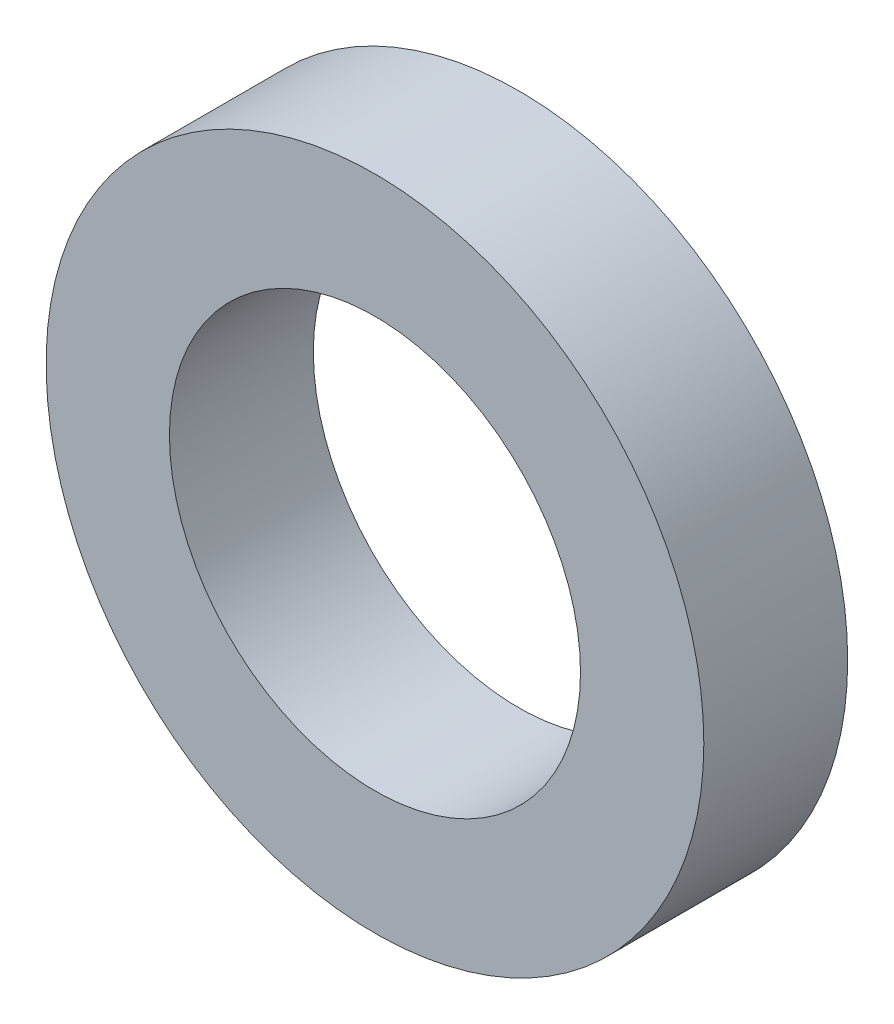
ISO-10303-21;
HEADER;
FILE_DESCRIPTION(('STEP AP214'),'2;1');
FILE_NAME('part.step','',(''),(''),'','','');
FILE_SCHEMA(('AUTOMOTIVE_DESIGN { 1 0 10303 214 1 1 1 1 }'));
ENDSEC;
DATA;
#1=APPLICATION_CONTEXT('core data for automotive mechanical design processes');
#2=APPLICATION_PROTOCOL_DEFINITION('international standard','automotive_design',2000,#1);
#3=PRODUCT_CONTEXT('',#1,'mechanical');
#4=PRODUCT('Part','Part','',(#3));
#5=PRODUCT_RELATED_PRODUCT_CATEGORY('part','',(#4));
#6=PRODUCT_DEFINITION_FORMATION('','',#4);
#7=PRODUCT_DEFINITION_CONTEXT('part definition',#1,'design');
#8=PRODUCT_DEFINITION('design','',#6,#7);
#9=PRODUCT_DEFINITION_SHAPE('','',#8);
#10=(LENGTH_UNIT() NAMED_UNIT(*) SI_UNIT(.MILLI.,.METRE.));
#11=(NAMED_UNIT(*) PLANE_ANGLE_UNIT() SI_UNIT($,.RADIAN.));
#12=(NAMED_UNIT(*) SI_UNIT($,.STERADIAN.) SOLID_ANGLE_UNIT());
#13=UNCERTAINTY_MEASURE_WITH_UNIT(LENGTH_MEASURE(1.E-05),#10,'distance_accuracy_value','');
#14=(GEOMETRIC_REPRESENTATION_CONTEXT(3) GLOBAL_UNCERTAINTY_ASSIGNED_CONTEXT((#13)) GLOBAL_UNIT_ASSIGNED_CONTEXT((#10,
#11,#12)) REPRESENTATION_CONTEXT('',''));
#15=CARTESIAN_POINT('',(0.,0.,0.));
#16=DIRECTION('',(0.,0.,1.));
#17=DIRECTION('',(1.,0.,0.));
#18=AXIS2_PLACEMENT_3D('',#15,#16,#17);
#19=CARTESIAN_POINT('',(0.,0.,3.5));
#20=DIRECTION('',(0.,0.,-1.));
#21=DIRECTION('',(-1.,0.,0.));
#22=AXIS2_PLACEMENT_3D('',#19,#20,#21);
#23=CYLINDRICAL_SURFACE('',#22,16.);
#24=CARTESIAN_POINT('',(0.,0.,3.5));
#25=DIRECTION('',(0.,0.,1.));
#26=DIRECTION('',(1.,0.,0.));
#27=AXIS2_PLACEMENT_3D('',#24,#25,#26);
#28=CIRCLE('',#27,16.);
#29=CARTESIAN_POINT('',(16.,0.,3.5));
#30=VERTEX_POINT('',#29);
#31=EDGE_CURVE('E10',#30,#30,#28,.T.);
#32=ORIENTED_EDGE('',*,*,#31,.F.);
#33=EDGE_LOOP('',(#32));
#34=FACE_BOUND('',#33,.T.);
#35=CARTESIAN_POINT('',(0.,0.,-3.5));
#36=DIRECTION('',(0.,0.,1.));
#37=DIRECTION('',(1.,0.,0.));
#38=AXIS2_PLACEMENT_3D('',#35,#36,#37);
#39=CIRCLE('',#38,16.);
#40=CARTESIAN_POINT('',(16.,0.,-3.5));
#41=VERTEX_POINT('',#40);
#42=EDGE_CURVE('E46',#41,#41,#39,.T.);
#43=ORIENTED_EDGE('',*,*,#42,.T.);
#44=EDGE_LOOP('',(#43));
#45=FACE_BOUND('',#44,.T.);
#46=ADVANCED_FACE('F39',(#34,#45),#23,.T.);
#47=CARTESIAN_POINT('',(0.,0.,3.5));
#48=DIRECTION('',(0.,0.,1.));
#49=DIRECTION('',(1.,0.,0.));
#50=AXIS2_PLACEMENT_3D('',#47,#48,#49);
#51=PLANE('',#50);
#52=CARTESIAN_POINT('',(0.,0.,3.5));
#53=DIRECTION('',(0.,0.,1.));
#54=DIRECTION('',(1.,0.,0.));
#55=AXIS2_PLACEMENT_3D('',#52,#53,#54);
#56=CIRCLE('',#55,10.);
#57=CARTESIAN_POINT('',(10.,0.,3.5));
#58=VERTEX_POINT('',#57);
#59=EDGE_CURVE('E51',#58,#58,#56,.F.);
#60=ORIENTED_EDGE('',*,*,#59,.T.);
#61=EDGE_LOOP('',(#60));
#62=FACE_BOUND('',#61,.T.);
#63=ORIENTED_EDGE('',*,*,#31,.T.);
#64=EDGE_LOOP('',(#63));
#65=FACE_BOUND('',#64,.T.);
#66=ADVANCED_FACE('F64',(#62,#65),#51,.T.);
#67=CARTESIAN_POINT('',(0.,0.,-3.5));
#68=DIRECTION('',(0.,0.,1.));
#69=DIRECTION('',(1.,0.,0.));
#70=AXIS2_PLACEMENT_3D('',#67,#68,#69);
#71=PLANE('',#70);
#72=CARTESIAN_POINT('',(0.,0.,-3.5));
#73=DIRECTION('',(0.,0.,1.));
#74=DIRECTION('',(1.,0.,0.));
#75=AXIS2_PLACEMENT_3D('',#72,#73,#74);
#76=CIRCLE('',#75,10.);
#77=CARTESIAN_POINT('',(10.,0.,-3.5));
#78=VERTEX_POINT('',#77);
#79=EDGE_CURVE('E42',#78,#78,#76,.F.);
#80=ORIENTED_EDGE('',*,*,#79,.F.);
#81=EDGE_LOOP('',(#80));
#82=FACE_BOUND('',#81,.T.);
#83=ORIENTED_EDGE('',*,*,#42,.F.);
#84=EDGE_LOOP('',(#83));
#85=FACE_BOUND('',#84,.T.);
#86=ADVANCED_FACE('F61',(#82,#85),#71,.F.);
#87=CARTESIAN_POINT('',(0.,0.,4.));
#88=DIRECTION('',(0.,0.,-1.));
#89=DIRECTION('',(-1.,0.,0.));
#90=AXIS2_PLACEMENT_3D('',#87,#88,#89);
#91=CYLINDRICAL_SURFACE('',#90,10.);
#92=ORIENTED_EDGE('',*,*,#59,.F.);
#93=EDGE_LOOP('',(#92));
#94=FACE_BOUND('',#93,.T.);
#95=ORIENTED_EDGE('',*,*,#79,.T.);
#96=EDGE_LOOP('',(#95));
#97=FACE_BOUND('',#96,.T.);
#98=ADVANCED_FACE('F59',(#94,#97),#91,.F.);
#99=CLOSED_SHELL('',(#46,#66,#86,#98));
#100=MANIFOLD_SOLID_BREP('B2',#99);
#101=ADVANCED_BREP_SHAPE_REPRESENTATION('',(#18,#100),#14);
#102=SHAPE_DEFINITION_REPRESENTATION(#9,#101);
ENDSEC;
END-ISO-10303-21;
